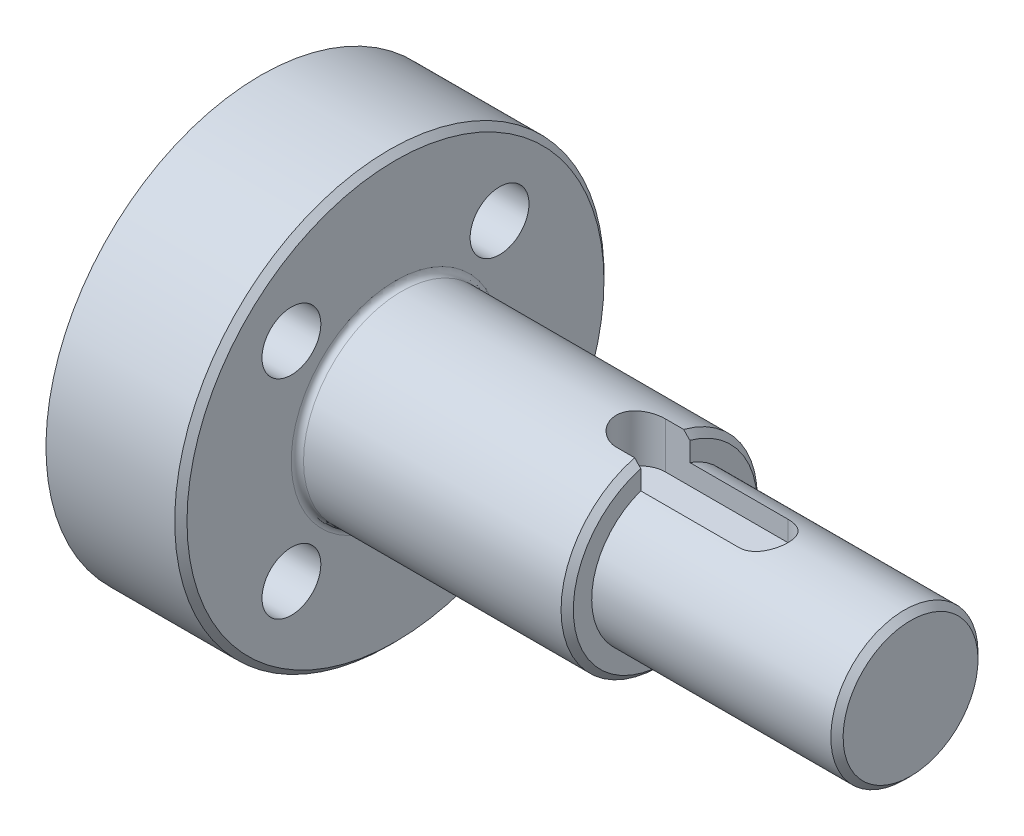
ISO-10303-21;
HEADER;
FILE_DESCRIPTION(('STEP AP214'),'2;1');
FILE_NAME('part.step','',(''),(''),'','','');
FILE_SCHEMA(('AUTOMOTIVE_DESIGN { 1 0 10303 214 1 1 1 1 }'));
ENDSEC;
DATA;
#1=APPLICATION_CONTEXT('core data for automotive mechanical design processes');
#2=APPLICATION_PROTOCOL_DEFINITION('international standard','automotive_design',2000,#1);
#3=PRODUCT_CONTEXT('',#1,'mechanical');
#4=PRODUCT('Part','Part','',(#3));
#5=PRODUCT_RELATED_PRODUCT_CATEGORY('part','',(#4));
#6=PRODUCT_DEFINITION_FORMATION('','',#4);
#7=PRODUCT_DEFINITION_CONTEXT('part definition',#1,'design');
#8=PRODUCT_DEFINITION('design','',#6,#7);
#9=PRODUCT_DEFINITION_SHAPE('','',#8);
#10=(LENGTH_UNIT() NAMED_UNIT(*) SI_UNIT(.MILLI.,.METRE.));
#11=(NAMED_UNIT(*) PLANE_ANGLE_UNIT() SI_UNIT($,.RADIAN.));
#12=(NAMED_UNIT(*) SI_UNIT($,.STERADIAN.) SOLID_ANGLE_UNIT());
#13=UNCERTAINTY_MEASURE_WITH_UNIT(LENGTH_MEASURE(1.E-05),#10,'distance_accuracy_value','');
#14=(GEOMETRIC_REPRESENTATION_CONTEXT(3) GLOBAL_UNCERTAINTY_ASSIGNED_CONTEXT((#13)) GLOBAL_UNIT_ASSIGNED_CONTEXT((#10,
#11,#12)) REPRESENTATION_CONTEXT('',''));
#15=CARTESIAN_POINT('',(0.,0.,0.));
#16=DIRECTION('',(0.,0.,1.));
#17=DIRECTION('',(1.,0.,0.));
#18=AXIS2_PLACEMENT_3D('',#15,#16,#17);
#19=CARTESIAN_POINT('',(24.,0.,0.));
#20=DIRECTION('',(1.,0.,0.));
#21=DIRECTION('',(0.,1.,0.));
#22=AXIS2_PLACEMENT_3D('',#19,#20,#21);
#23=CYLINDRICAL_SURFACE('',#22,3.);
#24=CARTESIAN_POINT('',(23.75,0.,0.));
#25=DIRECTION('',(-1.,0.,0.));
#26=DIRECTION('',(0.,-1.,0.));
#27=AXIS2_PLACEMENT_3D('',#24,#25,#26);
#28=CIRCLE('',#27,3.);
#29=CARTESIAN_POINT('',(23.75,-3.,0.));
#30=VERTEX_POINT('',#29);
#31=EDGE_CURVE('E260',#30,#30,#28,.T.);
#32=ORIENTED_EDGE('',*,*,#31,.T.);
#33=EDGE_LOOP('',(#32));
#34=FACE_BOUND('',#33,.T.);
#35=DIRECTION('',(1.,0.,0.));
#36=VECTOR('',#35,1.);
#37=CARTESIAN_POINT('',(24.,2.82842712474619,1.));
#38=LINE('',#37,#36);
#39=CARTESIAN_POINT('',(14.,2.82842712474619,1.));
#40=VERTEX_POINT('',#39);
#41=CARTESIAN_POINT('',(18.,2.82842712474619,1.));
#42=VERTEX_POINT('',#41);
#43=EDGE_CURVE('E181',#40,#42,#38,.T.);
#44=ORIENTED_EDGE('',*,*,#43,.F.);
#45=CARTESIAN_POINT('',(14.,0.,0.));
#46=DIRECTION('',(1.,0.,0.));
#47=DIRECTION('',(0.,1.,0.));
#48=AXIS2_PLACEMENT_3D('',#45,#46,#47);
#49=CIRCLE('',#48,3.);
#50=CARTESIAN_POINT('',(14.,2.82842712474619,-1.));
#51=VERTEX_POINT('',#50);
#52=EDGE_CURVE('E229',#40,#51,#49,.T.);
#53=ORIENTED_EDGE('',*,*,#52,.T.);
#54=DIRECTION('',(1.,0.,0.));
#55=VECTOR('',#54,1.);
#56=CARTESIAN_POINT('',(24.,2.82842712474619,-1.));
#57=LINE('',#56,#55);
#58=CARTESIAN_POINT('',(18.,2.82842712474619,-1.));
#59=VERTEX_POINT('',#58);
#60=EDGE_CURVE('E173',#59,#51,#57,.F.);
#61=ORIENTED_EDGE('',*,*,#60,.F.);
#62=CARTESIAN_POINT('',(18.,2.82842712474619,1.));
#63=CARTESIAN_POINT('',(18.0272904968011,2.82842442094339,1.0000007474592));
#64=CARTESIAN_POINT('',(18.0545670621893,2.82882259943245,0.998882124587392));
#65=CARTESIAN_POINT('',(18.1089085840549,2.83039327289221,0.994425607036402));
#66=CARTESIAN_POINT('',(18.1359735956597,2.83156555884122,0.991088311433525));
#67=CARTESIAN_POINT('',(18.2163921431951,2.83619092224651,0.977810675230789));
#68=CARTESIAN_POINT('',(18.2691808462705,2.84075292499515,0.964604233028114));
#69=CARTESIAN_POINT('',(18.3716251924438,2.85228074698859,0.929958411830429));
#70=CARTESIAN_POINT('',(18.4212825468729,2.85924523952929,0.908523575987535));
#71=CARTESIAN_POINT('',(18.5163398340055,2.8747878721946,0.85807322896487));
#72=CARTESIAN_POINT('',(18.5617371290674,2.88336700228108,0.829053062822737));
#73=CARTESIAN_POINT('',(18.6487202313245,2.90154480402047,0.763051393523013));
#74=CARTESIAN_POINT('',(18.6901148804626,2.91116877768309,0.725824980322037));
#75=CARTESIAN_POINT('',(18.7662060177917,2.93013848692978,0.644988442991483));
#76=CARTESIAN_POINT('',(18.8009013132559,2.93948417271853,0.601377184554538));
#77=CARTESIAN_POINT('',(18.8634795188042,2.95713882994227,0.507603645956267));
#78=CARTESIAN_POINT('',(18.8911609844023,2.96541437561854,0.4573000893585));
#79=CARTESIAN_POINT('',(18.9375922516873,2.97969608604658,0.352429249965862));
#80=CARTESIAN_POINT('',(18.9563447818204,2.98570294393309,0.297863275593423));
#81=CARTESIAN_POINT('',(18.9837357260914,2.99459071142922,0.188029345478039));
#82=CARTESIAN_POINT('',(18.9927032725537,2.99757308988573,0.132851834460114));
#83=CARTESIAN_POINT('',(19.0013162985256,3.00043608403817,0.0216989694556749));
#84=CARTESIAN_POINT('',(19.0009639992698,3.00031743881302,-0.0342761912453906));
#85=CARTESIAN_POINT('',(18.9911557168934,2.99706038635266,-0.14310384527939));
#86=CARTESIAN_POINT('',(18.9820573620405,2.99404060991264,-0.195992702625535));
#87=CARTESIAN_POINT('',(18.9556068013259,2.98546960500823,-0.299444064376654));
#88=CARTESIAN_POINT('',(18.9382541377938,2.97991823617731,-0.350006439616462));
#89=CARTESIAN_POINT('',(18.8955786303994,2.96675668271304,-0.44815262303096));
#90=CARTESIAN_POINT('',(18.8701539548777,2.95912037838312,-0.49568850565399));
#91=CARTESIAN_POINT('',(18.8121400486093,2.94258387680044,-0.585924589097487));
#92=CARTESIAN_POINT('',(18.7795488689535,2.93368333597593,-0.628623469714683));
#93=CARTESIAN_POINT('',(18.7063289500032,2.91506271942739,-0.71009733971121));
#94=CARTESIAN_POINT('',(18.6653944563903,2.90532378679914,-0.748593611612697));
#95=CARTESIAN_POINT('',(18.5775585102838,2.88647490472851,-0.818272024820382));
#96=CARTESIAN_POINT('',(18.5306551375968,2.87736515915753,-0.849451803183812));
#97=CARTESIAN_POINT('',(18.4313198216467,2.86070031376317,-0.904003325592782));
#98=CARTESIAN_POINT('',(18.3788164850671,2.85317014948234,-0.927253009507682));
#99=CARTESIAN_POINT('',(18.2703530224101,2.84081097062039,-0.964460230701116));
#100=CARTESIAN_POINT('',(18.2143985066279,2.83597769408993,-0.978432436055355));
#101=CARTESIAN_POINT('',(18.131581363252,2.8313654209472,-0.991658156280828));
#102=CARTESIAN_POINT('',(18.1053586101458,2.83026667694602,-0.994785061255116));
#103=CARTESIAN_POINT('',(18.0527619216002,2.82879703571399,-0.998954616071198));
#104=CARTESIAN_POINT('',(18.0263882254556,2.82842519929528,-0.999999955394979));
#105=CARTESIAN_POINT('',(18.,2.82842712474619,-1.));
#106=B_SPLINE_CURVE_WITH_KNOTS('',3,(#62,#63,#64,#65,#66,#67,#68,#69,#70,#71,#72,#73,#74,#75,
#76,#77,#78,#79,#80,#81,#82,#83,#84,#85,#86,#87,#88,#89,#90,#91,#92,#93,#94,#95,#96,#97,#98,#99,
#100,#101,#102,#103,#104,#105),.UNSPECIFIED.,.F.,.F.,(4,2,2,2,2,2,2,2,2,2,2,2,2,2,2,2,2,2,2,2,2,
4),(0.,0.0818184847354301,0.16361488616946,0.326581198395371,0.489457660966237,
0.652434313135311,0.821165049626774,0.98992579863747,1.16309132933101,1.33620391121127,
1.50329470727403,1.67034568030642,1.83084418465735,1.99135158908248,2.15397018825967,
2.31663306588768,2.4869405405805,2.65730294249242,2.8301802992804,3.00278367486839,
3.08199895332751,3.16111181529057),.UNSPECIFIED.);
#107=EDGE_CURVE('E297',#42,#59,#106,.T.);
#108=ORIENTED_EDGE('',*,*,#107,.F.);
#109=EDGE_LOOP('',(#44,#53,#61,#108));
#110=FACE_BOUND('',#109,.T.);
#111=ADVANCED_FACE('F65',(#34,#110),#23,.T.);
#112=CARTESIAN_POINT('',(14.,0.,0.));
#113=DIRECTION('',(-1.,0.,0.));
#114=DIRECTION('',(0.,-1.,0.));
#115=AXIS2_PLACEMENT_3D('',#112,#113,#114);
#116=PLANE('',#115);
#117=DIRECTION('',(0.,-1.,0.));
#118=VECTOR('',#117,1.);
#119=CARTESIAN_POINT('',(14.,0.,1.));
#120=LINE('',#119,#118);
#121=CARTESIAN_POINT('',(14.,3.61420807370024,1.));
#122=VERTEX_POINT('',#121);
#123=EDGE_CURVE('E89',#122,#40,#120,.T.);
#124=ORIENTED_EDGE('',*,*,#123,.F.);
#125=CARTESIAN_POINT('',(14.,0.,0.));
#126=DIRECTION('',(-1.,0.,0.));
#127=DIRECTION('',(0.,-1.,0.));
#128=AXIS2_PLACEMENT_3D('',#125,#126,#127);
#129=CIRCLE('',#128,3.75);
#130=CARTESIAN_POINT('',(14.,3.61420807370024,-1.));
#131=VERTEX_POINT('',#130);
#132=EDGE_CURVE('E248',#122,#131,#129,.F.);
#133=ORIENTED_EDGE('',*,*,#132,.T.);
#134=DIRECTION('',(0.,1.,0.));
#135=VECTOR('',#134,1.);
#136=CARTESIAN_POINT('',(14.,0.,-1.));
#137=LINE('',#136,#135);
#138=EDGE_CURVE('E81',#51,#131,#137,.T.);
#139=ORIENTED_EDGE('',*,*,#138,.F.);
#140=ORIENTED_EDGE('',*,*,#52,.F.);
#141=EDGE_LOOP('',(#124,#133,#139,#140));
#142=FACE_BOUND('',#141,.T.);
#143=ADVANCED_FACE('F313',(#142),#116,.F.);
#144=CARTESIAN_POINT('',(24.,0.,0.));
#145=DIRECTION('',(1.,0.,0.));
#146=DIRECTION('',(0.,1.,0.));
#147=AXIS2_PLACEMENT_3D('',#144,#145,#146);
#148=CYLINDRICAL_SURFACE('',#147,4.);
#149=CARTESIAN_POINT('',(3.25,0.,0.));
#150=DIRECTION('',(-1.,0.,0.));
#151=DIRECTION('',(0.,-1.,0.));
#152=AXIS2_PLACEMENT_3D('',#149,#150,#151);
#153=CIRCLE('',#152,4.);
#154=CARTESIAN_POINT('',(3.25,-4.,0.));
#155=VERTEX_POINT('',#154);
#156=EDGE_CURVE('E74',#155,#155,#153,.F.);
#157=ORIENTED_EDGE('',*,*,#156,.T.);
#158=EDGE_LOOP('',(#157));
#159=FACE_BOUND('',#158,.T.);
#160=DIRECTION('',(1.,0.,0.));
#161=VECTOR('',#160,1.);
#162=CARTESIAN_POINT('',(24.,3.87298334620741,1.));
#163=LINE('',#162,#161);
#164=CARTESIAN_POINT('',(13.,3.87298334620741,1.));
#165=VERTEX_POINT('',#164);
#166=CARTESIAN_POINT('',(13.75,3.87298334620741,1.));
#167=VERTEX_POINT('',#166);
#168=EDGE_CURVE('E176',#165,#167,#163,.T.);
#169=ORIENTED_EDGE('',*,*,#168,.F.);
#170=CARTESIAN_POINT('',(13.,3.87298334620741,-1.));
#171=CARTESIAN_POINT('',(12.9723370148935,3.87298148580177,-1.00000033749611));
#172=CARTESIAN_POINT('',(12.9446877369818,3.8732800994947,-0.998851407375366));
#173=CARTESIAN_POINT('',(12.8895959646964,3.87445904774559,-0.994271295395754));
#174=CARTESIAN_POINT('',(12.8621534363129,3.87533928441687,-0.990840497572679));
#175=CARTESIAN_POINT('',(12.7805468267912,3.87881710972053,-0.977175239382526));
#176=CARTESIAN_POINT('',(12.7269435315178,3.88225203148809,-0.963567695172493));
#177=CARTESIAN_POINT('',(12.622875326218,3.89095422588002,-0.927798076247997));
#178=CARTESIAN_POINT('',(12.5724101217871,3.89622132630929,-0.905636805423836));
#179=CARTESIAN_POINT('',(12.4758885513527,3.90799134471939,-0.853415378025866));
#180=CARTESIAN_POINT('',(12.429833372109,3.91449459395647,-0.823353103356933));
#181=CARTESIAN_POINT('',(12.3424561180939,3.92816262398025,-0.75548447182807));
#182=CARTESIAN_POINT('',(12.3012451137545,3.93533791028916,-0.717537268783977));
#183=CARTESIAN_POINT('',(12.2256979105173,3.94945104396193,-0.635275780516231));
#184=CARTESIAN_POINT('',(12.1913628105321,3.95638885322537,-0.590960479478832));
#185=CARTESIAN_POINT('',(12.1300889983814,3.96936182283248,-0.496456899401691));
#186=CARTESIAN_POINT('',(12.103260104016,3.9753830468173,-0.446195340334474));
#187=CARTESIAN_POINT('',(12.0584752658033,3.98572346250588,-0.34170259084292));
#188=CARTESIAN_POINT('',(12.0405175757002,3.990042989147,-0.28747218408301));
#189=CARTESIAN_POINT('',(12.0143410072226,3.99641900005128,-0.177744108525161));
#190=CARTESIAN_POINT('',(12.0059323275772,3.99851952901301,-0.122294322002858));
#191=CARTESIAN_POINT('',(11.9984966284567,4.00037438150815,-0.0107327756816804));
#192=CARTESIAN_POINT('',(11.9994684298077,4.00012899993444,0.0453789000287047));
#193=CARTESIAN_POINT('',(12.0106299636855,3.99735237365736,0.155352492972095));
#194=CARTESIAN_POINT('',(12.0206146165995,3.9948719867736,0.209236701739854));
#195=CARTESIAN_POINT('',(12.0491886791828,3.98796330636496,0.314538711084339));
#196=CARTESIAN_POINT('',(12.0677784695686,3.98353492665556,0.365956402423987));
#197=CARTESIAN_POINT('',(12.1132012806707,3.97314997761798,0.465407286024538));
#198=CARTESIAN_POINT('',(12.1401073942328,3.96717993827555,0.513405629602247));
#199=CARTESIAN_POINT('',(12.2013431298335,3.95435945541919,0.604276631230013));
#200=CARTESIAN_POINT('',(12.2356738702532,3.94750887933198,0.647148515562288));
#201=CARTESIAN_POINT('',(12.3118789120813,3.93345566022865,0.72776938970849));
#202=CARTESIAN_POINT('',(12.3539316365398,3.92624850477685,0.765349103054126));
#203=CARTESIAN_POINT('',(12.4438298669277,3.91246168284006,0.832969575186236));
#204=CARTESIAN_POINT('',(12.4916769532836,3.90588218842993,0.863008270245061));
#205=CARTESIAN_POINT('',(12.5921455978238,3.89407813586325,0.914804709285961));
#206=CARTESIAN_POINT('',(12.6447914648961,3.88886106009136,0.936517017887269));
#207=CARTESIAN_POINT('',(12.7531169284183,3.88047058807055,0.970702351849828));
#208=CARTESIAN_POINT('',(12.8087918551498,3.87729413761435,0.983189189212131));
#209=CARTESIAN_POINT('',(12.8874573807589,3.87455290681524,0.993904635150937));
#210=CARTESIAN_POINT('',(12.9099197032132,3.87396523110859,0.996190790966708));
#211=CARTESIAN_POINT('',(12.9549177899093,3.87318062488974,0.999236757697393));
#212=CARTESIAN_POINT('',(12.9774533759553,3.87298306219461,0.999999038096045));
#213=CARTESIAN_POINT('',(13.,3.87298334620741,1.));
#214=B_SPLINE_CURVE_WITH_KNOTS('',3,(#170,#171,#172,#173,#174,#175,#176,#177,#178,#179,#180,
#181,#182,#183,#184,#185,#186,#187,#188,#189,#190,#191,#192,#193,#194,#195,#196,#197,#198,#199,
#200,#201,#202,#203,#204,#205,#206,#207,#208,#209,#210,#211,#212,#213),.UNSPECIFIED.,.F.,.F.,(4,
2,2,2,2,2,2,2,2,2,2,2,2,2,2,2,2,2,2,2,2,4),(0.,0.0829365303397727,0.165859106084653,
0.331229963080316,0.496585282091499,0.661984974726748,0.830641897427973,0.999325753539192,
1.17036187098235,1.34136430732424,1.50890481515325,1.67642426256639,1.84022545479275,
2.00403389475838,2.16932509450376,2.33464120964329,2.50441429534542,2.67423379180967,
2.84496720161068,3.01544447539986,3.08315848722648,3.15076267731671),.UNSPECIFIED.);
#215=CARTESIAN_POINT('',(13.,3.87298334620741,-1.));
#216=VERTEX_POINT('',#215);
#217=EDGE_CURVE('E132',#216,#165,#214,.T.);
#218=ORIENTED_EDGE('',*,*,#217,.F.);
#219=DIRECTION('',(1.,0.,0.));
#220=VECTOR('',#219,1.);
#221=CARTESIAN_POINT('',(24.,3.87298334620741,-1.));
#222=LINE('',#221,#220);
#223=CARTESIAN_POINT('',(13.75,3.87298334620741,-1.));
#224=VERTEX_POINT('',#223);
#225=EDGE_CURVE('E135',#224,#216,#222,.F.);
#226=ORIENTED_EDGE('',*,*,#225,.F.);
#227=CARTESIAN_POINT('',(13.75,0.,0.));
#228=DIRECTION('',(-1.,0.,0.));
#229=DIRECTION('',(0.,-1.,0.));
#230=AXIS2_PLACEMENT_3D('',#227,#228,#229);
#231=CIRCLE('',#230,4.);
#232=EDGE_CURVE('E252',#224,#167,#231,.T.);
#233=ORIENTED_EDGE('',*,*,#232,.T.);
#234=EDGE_LOOP('',(#169,#218,#226,#233));
#235=FACE_BOUND('',#234,.T.);
#236=ADVANCED_FACE('F390',(#159,#235),#148,.T.);
#237=CARTESIAN_POINT('',(14.,0.,0.));
#238=DIRECTION('',(-1.,0.,0.));
#239=DIRECTION('',(0.,-1.,0.));
#240=AXIS2_PLACEMENT_3D('',#237,#238,#239);
#241=CONICAL_SURFACE('',#240,3.75,0.785398163397448);
#242=ORIENTED_EDGE('',*,*,#132,.F.);
#243=CARTESIAN_POINT('',(16.0157644370746,1.41688848810168,1.));
#244=CARTESIAN_POINT('',(15.9620809124287,1.48254695804357,1.));
#245=CARTESIAN_POINT('',(15.9077076974055,1.5476319600914,1.));
#246=CARTESIAN_POINT('',(15.7978901131886,1.67688164271462,1.));
#247=CARTESIAN_POINT('',(15.7424458562416,1.74104641851612,1.));
#248=CARTESIAN_POINT('',(15.630797709636,1.86867914905829,1.));
#249=CARTESIAN_POINT('',(15.5745940225952,1.9321472817835,1.));
#250=CARTESIAN_POINT('',(15.4615877619381,2.05855103573608,1.));
#251=CARTESIAN_POINT('',(15.4047851703288,2.12148664086183,1.));
#252=CARTESIAN_POINT('',(15.2337287968054,2.3096244705968,1.));
#253=CARTESIAN_POINT('',(15.1187878570313,2.43420138547952,1.));
#254=CARTESIAN_POINT('',(14.8877307759525,2.68227567826739,1.));
#255=CARTESIAN_POINT('',(14.7716145370067,2.80577296486452,1.));
#256=CARTESIAN_POINT('',(14.535145262508,3.05564542967055,1.));
#257=CARTESIAN_POINT('',(14.4147683278564,3.18199797105842,1.));
#258=CARTESIAN_POINT('',(14.1734176866013,3.43413175641541,1.));
#259=CARTESIAN_POINT('',(14.0524439782558,3.55991299871494,1.));
#260=CARTESIAN_POINT('',(13.6888841628384,3.93662719801796,1.));
#261=CARTESIAN_POINT('',(13.4456530030218,4.18693731103132,1.));
#262=CARTESIAN_POINT('',(12.9580802516466,4.68673547289824,1.));
#263=CARTESIAN_POINT('',(12.713738131154,4.93622300455382,1.));
#264=CARTESIAN_POINT('',(12.2243982797071,5.43455143633785,1.));
#265=CARTESIAN_POINT('',(11.9794005529469,5.68339234058296,1.));
#266=CARTESIAN_POINT('',(11.7342355629254,5.93206724189569,1.));
#267=B_SPLINE_CURVE_WITH_KNOTS('',3,(#243,#244,#245,#246,#247,#248,#249,#250,#251,#252,#253,
#254,#255,#256,#257,#258,#259,#260,#261,#262,#263,#264,#265,#266),.UNSPECIFIED.,.F.,.F.,(4,2,2,
2,2,2,2,2,2,2,2,4),(0.,0.254418535812733,0.508810551312933,0.763135984405125,1.01746908005956,
1.5259605074314,2.0344945315925,2.55803735603119,3.08158170951894,4.12864273413816,
5.17626945243916,6.22388948476793),.UNSPECIFIED.);
#268=EDGE_CURVE('E273',#122,#167,#267,.T.);
#269=ORIENTED_EDGE('',*,*,#268,.T.);
#270=ORIENTED_EDGE('',*,*,#232,.F.);
#271=CARTESIAN_POINT('',(11.7342355629254,5.93206724189568,-1.));
#272=CARTESIAN_POINT('',(11.9162929379125,5.74742737321911,-1.));
#273=CARTESIAN_POINT('',(12.0982444664237,5.56268279745674,-1.));
#274=CARTESIAN_POINT('',(12.4618186251271,5.19288411268343,-1.));
#275=CARTESIAN_POINT('',(12.64344126751,5.00783001565555,-1.));
#276=CARTESIAN_POINT('',(13.0062097446631,4.63734365743845,-1.));
#277=CARTESIAN_POINT('',(13.1873556854789,4.45191150016412,-1.));
#278=CARTESIAN_POINT('',(13.5490319311143,4.08043296138168,-1.));
#279=CARTESIAN_POINT('',(13.7295622108332,3.89438655542484,-1.));
#280=CARTESIAN_POINT('',(14.0897640511782,3.52132305951913,-1.));
#281=CARTESIAN_POINT('',(14.2694352524438,3.33430562178076,-1.));
#282=CARTESIAN_POINT('',(14.5377995421626,3.05270801328353,-1.));
#283=CARTESIAN_POINT('',(14.6270594490508,2.95866830066621,-1.));
#284=CARTESIAN_POINT('',(14.8050795880422,2.77011312870758,-1.));
#285=CARTESIAN_POINT('',(14.8938398101726,2.67559765994182,-1.));
#286=CARTESIAN_POINT('',(15.070720644728,2.48590318372165,-1.));
#287=CARTESIAN_POINT('',(15.1588410064363,2.39072394209098,-1.));
#288=CARTESIAN_POINT('',(15.3341392810104,2.19950986548784,-1.));
#289=CARTESIAN_POINT('',(15.4213172454583,2.10347507787388,-1.));
#290=CARTESIAN_POINT('',(15.5943500764221,1.91015664129409,-1.));
#291=CARTESIAN_POINT('',(15.6802044916629,1.81287258623483,-1.));
#292=CARTESIAN_POINT('',(15.8074323949499,1.66558625041674,-1.));
#293=CARTESIAN_POINT('',(15.8495865788171,1.61625946014545,-1.));
#294=CARTESIAN_POINT('',(15.9332208443044,1.51703284247258,-1.));
#295=CARTESIAN_POINT('',(15.9747008824898,1.46713297849894,-1.));
#296=CARTESIAN_POINT('',(16.0157644370746,1.41688848810168,-1.));
#297=B_SPLINE_CURVE_WITH_KNOTS('',3,(#271,#272,#273,#274,#275,#276,#277,#278,#279,#280,#281,
#282,#283,#284,#285,#286,#287,#288,#289,#290,#291,#292,#293,#294,#295,#296),.UNSPECIFIED.,.F.,
.F.,(4,2,2,2,2,2,2,2,2,2,2,2,4),(0.,0.777901926687156,1.55577440363923,2.33345604171232,
3.11116901601679,3.88918296409064,4.27815101505478,4.66712680180913,5.05624756252509,
5.44534691577915,5.83457612542308,6.02922682543276,6.22389001734463),.UNSPECIFIED.);
#298=EDGE_CURVE('E264',#224,#131,#297,.T.);
#299=ORIENTED_EDGE('',*,*,#298,.T.);
#300=EDGE_LOOP('',(#242,#269,#270,#299));
#301=FACE_BOUND('',#300,.T.);
#302=ADVANCED_FACE('F281',(#301),#241,.T.);
#303=CARTESIAN_POINT('',(-0.25,0.,0.));
#304=DIRECTION('',(1.,0.,0.));
#305=DIRECTION('',(0.,1.,0.));
#306=AXIS2_PLACEMENT_3D('',#303,#304,#305);
#307=TOROIDAL_SURFACE('',#306,8.,0.25);
#308=CARTESIAN_POINT('',(-0.375,0.,0.));
#309=DIRECTION('',(1.,0.,0.));
#310=DIRECTION('',(0.,1.,0.));
#311=AXIS2_PLACEMENT_3D('',#308,#309,#310);
#312=CIRCLE('',#311,8.21650635094611);
#313=CARTESIAN_POINT('',(-0.375,8.21650635094611,0.));
#314=VERTEX_POINT('',#313);
#315=EDGE_CURVE('E213',#314,#314,#312,.T.);
#316=ORIENTED_EDGE('',*,*,#315,.F.);
#317=EDGE_LOOP('',(#316));
#318=FACE_BOUND('',#317,.T.);
#319=CARTESIAN_POINT('',(0.,0.,0.));
#320=DIRECTION('',(1.,0.,0.));
#321=DIRECTION('',(0.,1.,0.));
#322=AXIS2_PLACEMENT_3D('',#319,#320,#321);
#323=CIRCLE('',#322,8.);
#324=CARTESIAN_POINT('',(0.,8.,0.));
#325=VERTEX_POINT('',#324);
#326=EDGE_CURVE('E233',#325,#325,#323,.T.);
#327=ORIENTED_EDGE('',*,*,#326,.T.);
#328=EDGE_LOOP('',(#327));
#329=FACE_BOUND('',#328,.T.);
#330=ADVANCED_FACE('F323',(#318,#329),#307,.F.);
#331=CARTESIAN_POINT('',(0.,0.,0.));
#332=DIRECTION('',(1.,0.,0.));
#333=DIRECTION('',(0.,1.,0.));
#334=AXIS2_PLACEMENT_3D('',#331,#332,#333);
#335=PLANE('',#334);
#336=CARTESIAN_POINT('',(0.,4.24264068711926,4.24264068711931));
#337=DIRECTION('',(1.,0.,0.));
#338=DIRECTION('',(0.,1.,0.));
#339=AXIS2_PLACEMENT_3D('',#336,#337,#338);
#340=CIRCLE('',#339,1.2);
#341=CARTESIAN_POINT('',(0.,5.44264068711926,4.24264068711931));
#342=VERTEX_POINT('',#341);
#343=EDGE_CURVE('E188',#342,#342,#340,.T.);
#344=ORIENTED_EDGE('',*,*,#343,.T.);
#345=EDGE_LOOP('',(#344));
#346=FACE_BOUND('',#345,.T.);
#347=CARTESIAN_POINT('',(0.,-4.24264068711931,4.24264068711926));
#348=DIRECTION('',(1.,0.,0.));
#349=DIRECTION('',(0.,1.,0.));
#350=AXIS2_PLACEMENT_3D('',#347,#348,#349);
#351=CIRCLE('',#350,1.2);
#352=CARTESIAN_POINT('',(0.,-3.04264068711931,4.24264068711926));
#353=VERTEX_POINT('',#352);
#354=EDGE_CURVE('E196',#353,#353,#351,.T.);
#355=ORIENTED_EDGE('',*,*,#354,.T.);
#356=EDGE_LOOP('',(#355));
#357=FACE_BOUND('',#356,.T.);
#358=CARTESIAN_POINT('',(0.,-4.24264068711926,-4.24264068711931));
#359=DIRECTION('',(1.,0.,0.));
#360=DIRECTION('',(0.,1.,0.));
#361=AXIS2_PLACEMENT_3D('',#358,#359,#360);
#362=CIRCLE('',#361,1.2);
#363=CARTESIAN_POINT('',(0.,-3.04264068711926,-4.24264068711931));
#364=VERTEX_POINT('',#363);
#365=EDGE_CURVE('E204',#364,#364,#362,.T.);
#366=ORIENTED_EDGE('',*,*,#365,.T.);
#367=EDGE_LOOP('',(#366));
#368=FACE_BOUND('',#367,.T.);
#369=CARTESIAN_POINT('',(0.,4.24264068711931,-4.24264068711926));
#370=DIRECTION('',(1.,0.,0.));
#371=DIRECTION('',(0.,1.,0.));
#372=AXIS2_PLACEMENT_3D('',#369,#370,#371);
#373=CIRCLE('',#372,1.2);
#374=CARTESIAN_POINT('',(0.,5.44264068711931,-4.24264068711926));
#375=VERTEX_POINT('',#374);
#376=EDGE_CURVE('E209',#375,#375,#373,.T.);
#377=ORIENTED_EDGE('',*,*,#376,.T.);
#378=EDGE_LOOP('',(#377));
#379=FACE_BOUND('',#378,.T.);
#380=ORIENTED_EDGE('',*,*,#326,.F.);
#381=EDGE_LOOP('',(#380));
#382=FACE_BOUND('',#381,.T.);
#383=ADVANCED_FACE('F319',(#346,#357,#368,#379,#382),#335,.F.);
#384=CARTESIAN_POINT('',(24.,0.,0.));
#385=DIRECTION('',(-1.,0.,0.));
#386=DIRECTION('',(0.,-1.,0.));
#387=AXIS2_PLACEMENT_3D('',#384,#385,#386);
#388=PLANE('',#387);
#389=CARTESIAN_POINT('',(24.,0.,0.));
#390=DIRECTION('',(-1.,0.,0.));
#391=DIRECTION('',(0.,-1.,0.));
#392=AXIS2_PLACEMENT_3D('',#389,#390,#391);
#393=CIRCLE('',#392,2.75);
#394=CARTESIAN_POINT('',(24.,-2.75,0.));
#395=VERTEX_POINT('',#394);
#396=EDGE_CURVE('E256',#395,#395,#393,.F.);
#397=ORIENTED_EDGE('',*,*,#396,.T.);
#398=EDGE_LOOP('',(#397));
#399=FACE_BOUND('',#398,.T.);
#400=ADVANCED_FACE('F315',(#399),#388,.F.);
#401=CARTESIAN_POINT('',(3.,0.,0.));
#402=DIRECTION('',(-1.,0.,0.));
#403=DIRECTION('',(0.,-1.,0.));
#404=AXIS2_PLACEMENT_3D('',#401,#402,#403);
#405=PLANE('',#404);
#406=CARTESIAN_POINT('',(3.,0.,0.));
#407=DIRECTION('',(-1.,0.,0.));
#408=DIRECTION('',(0.,-1.,0.));
#409=AXIS2_PLACEMENT_3D('',#406,#407,#408);
#410=CIRCLE('',#409,4.25);
#411=CARTESIAN_POINT('',(3.,-4.25,0.));
#412=VERTEX_POINT('',#411);
#413=EDGE_CURVE('E13',#412,#412,#410,.T.);
#414=ORIENTED_EDGE('',*,*,#413,.T.);
#415=EDGE_LOOP('',(#414));
#416=FACE_BOUND('',#415,.T.);
#417=CARTESIAN_POINT('',(3.,0.,0.));
#418=DIRECTION('',(-1.,0.,0.));
#419=DIRECTION('',(0.,-1.,0.));
#420=AXIS2_PLACEMENT_3D('',#417,#418,#419);
#421=CIRCLE('',#420,8.5);
#422=CARTESIAN_POINT('',(3.,-8.5,0.));
#423=VERTEX_POINT('',#422);
#424=EDGE_CURVE('E237',#423,#423,#421,.F.);
#425=ORIENTED_EDGE('',*,*,#424,.T.);
#426=EDGE_LOOP('',(#425));
#427=FACE_BOUND('',#426,.T.);
#428=CARTESIAN_POINT('',(3.,4.24264068711926,4.24264068711931));
#429=DIRECTION('',(1.,0.,0.));
#430=DIRECTION('',(0.,0.,-1.));
#431=AXIS2_PLACEMENT_3D('',#428,#429,#430);
#432=CIRCLE('',#431,1.2);
#433=CARTESIAN_POINT('',(3.,4.24264068711926,3.04264068711931));
#434=VERTEX_POINT('',#433);
#435=EDGE_CURVE('E184',#434,#434,#432,.T.);
#436=ORIENTED_EDGE('',*,*,#435,.F.);
#437=EDGE_LOOP('',(#436));
#438=FACE_BOUND('',#437,.T.);
#439=CARTESIAN_POINT('',(3.,-4.24264068711931,4.24264068711926));
#440=DIRECTION('',(1.,0.,0.));
#441=DIRECTION('',(0.,0.,-1.));
#442=AXIS2_PLACEMENT_3D('',#439,#440,#441);
#443=CIRCLE('',#442,1.2);
#444=CARTESIAN_POINT('',(3.,-4.24264068711931,3.04264068711926));
#445=VERTEX_POINT('',#444);
#446=EDGE_CURVE('E192',#445,#445,#443,.T.);
#447=ORIENTED_EDGE('',*,*,#446,.F.);
#448=EDGE_LOOP('',(#447));
#449=FACE_BOUND('',#448,.T.);
#450=CARTESIAN_POINT('',(3.,-4.24264068711926,-4.24264068711931));
#451=DIRECTION('',(1.,0.,0.));
#452=DIRECTION('',(0.,0.,-1.));
#453=AXIS2_PLACEMENT_3D('',#450,#451,#452);
#454=CIRCLE('',#453,1.2);
#455=CARTESIAN_POINT('',(3.,-4.24264068711926,-5.44264068711931));
#456=VERTEX_POINT('',#455);
#457=EDGE_CURVE('E200',#456,#456,#454,.T.);
#458=ORIENTED_EDGE('',*,*,#457,.F.);
#459=EDGE_LOOP('',(#458));
#460=FACE_BOUND('',#459,.T.);
#461=CARTESIAN_POINT('',(3.,4.24264068711931,-4.24264068711926));
#462=DIRECTION('',(1.,0.,0.));
#463=DIRECTION('',(0.,0.,-1.));
#464=AXIS2_PLACEMENT_3D('',#461,#462,#463);
#465=CIRCLE('',#464,1.2);
#466=CARTESIAN_POINT('',(3.,4.24264068711931,-5.44264068711926));
#467=VERTEX_POINT('',#466);
#468=EDGE_CURVE('E205',#467,#467,#465,.T.);
#469=ORIENTED_EDGE('',*,*,#468,.F.);
#470=EDGE_LOOP('',(#469));
#471=FACE_BOUND('',#470,.T.);
#472=ADVANCED_FACE('F318',(#416,#427,#438,#449,#460,#471),#405,.F.);
#473=CARTESIAN_POINT('',(24.,0.,0.));
#474=DIRECTION('',(1.,0.,0.));
#475=DIRECTION('',(0.,1.,0.));
#476=AXIS2_PLACEMENT_3D('',#473,#474,#475);
#477=CYLINDRICAL_SURFACE('',#476,8.75);
#478=CARTESIAN_POINT('',(2.75,0.,0.));
#479=DIRECTION('',(-1.,0.,0.));
#480=DIRECTION('',(0.,-1.,0.));
#481=AXIS2_PLACEMENT_3D('',#478,#479,#480);
#482=CIRCLE('',#481,8.75);
#483=CARTESIAN_POINT('',(2.75,-8.75,0.));
#484=VERTEX_POINT('',#483);
#485=EDGE_CURVE('E244',#484,#484,#482,.T.);
#486=ORIENTED_EDGE('',*,*,#485,.T.);
#487=EDGE_LOOP('',(#486));
#488=FACE_BOUND('',#487,.T.);
#489=CARTESIAN_POINT('',(-2.5,0.,0.));
#490=DIRECTION('',(1.,0.,0.));
#491=DIRECTION('',(0.,1.,0.));
#492=AXIS2_PLACEMENT_3D('',#489,#490,#491);
#493=CIRCLE('',#492,8.75);
#494=CARTESIAN_POINT('',(-2.5,8.75,0.));
#495=VERTEX_POINT('',#494);
#496=EDGE_CURVE('E225',#495,#495,#493,.T.);
#497=ORIENTED_EDGE('',*,*,#496,.T.);
#498=EDGE_LOOP('',(#497));
#499=FACE_BOUND('',#498,.T.);
#500=ADVANCED_FACE('F349',(#488,#499),#477,.T.);
#501=CARTESIAN_POINT('',(-2.5,0.,0.));
#502=DIRECTION('',(1.,0.,0.));
#503=DIRECTION('',(0.,1.,0.));
#504=AXIS2_PLACEMENT_3D('',#501,#502,#503);
#505=PLANE('',#504);
#506=ORIENTED_EDGE('',*,*,#496,.F.);
#507=EDGE_LOOP('',(#506));
#508=FACE_BOUND('',#507,.T.);
#509=CARTESIAN_POINT('',(-2.5,0.,0.));
#510=DIRECTION('',(1.,0.,0.));
#511=DIRECTION('',(0.,1.,0.));
#512=AXIS2_PLACEMENT_3D('',#509,#510,#511);
#513=CIRCLE('',#512,8.);
#514=CARTESIAN_POINT('',(-2.5,8.,0.));
#515=VERTEX_POINT('',#514);
#516=EDGE_CURVE('E221',#515,#515,#513,.T.);
#517=ORIENTED_EDGE('',*,*,#516,.T.);
#518=EDGE_LOOP('',(#517));
#519=FACE_BOUND('',#518,.T.);
#520=ADVANCED_FACE('F384',(#508,#519),#505,.F.);
#521=CARTESIAN_POINT('',(24.,0.,0.));
#522=DIRECTION('',(1.,0.,0.));
#523=DIRECTION('',(0.,1.,0.));
#524=AXIS2_PLACEMENT_3D('',#521,#522,#523);
#525=CYLINDRICAL_SURFACE('',#524,8.);
#526=ORIENTED_EDGE('',*,*,#516,.F.);
#527=EDGE_LOOP('',(#526));
#528=FACE_BOUND('',#527,.T.);
#529=CARTESIAN_POINT('',(-0.749999999999997,0.,0.));
#530=DIRECTION('',(1.,0.,0.));
#531=DIRECTION('',(0.,1.,0.));
#532=AXIS2_PLACEMENT_3D('',#529,#530,#531);
#533=CIRCLE('',#532,8.);
#534=CARTESIAN_POINT('',(-0.749999999999997,8.,0.));
#535=VERTEX_POINT('',#534);
#536=EDGE_CURVE('E217',#535,#535,#533,.T.);
#537=ORIENTED_EDGE('',*,*,#536,.T.);
#538=EDGE_LOOP('',(#537));
#539=FACE_BOUND('',#538,.T.);
#540=ADVANCED_FACE('F377',(#528,#539),#525,.F.);
#541=CARTESIAN_POINT('',(-0.375,0.,0.));
#542=DIRECTION('',(1.,0.,0.));
#543=DIRECTION('',(0.,1.,0.));
#544=AXIS2_PLACEMENT_3D('',#541,#542,#543);
#545=CONICAL_SURFACE('',#544,8.21650635094611,0.523598775598301);
#546=ORIENTED_EDGE('',*,*,#536,.F.);
#547=EDGE_LOOP('',(#546));
#548=FACE_BOUND('',#547,.T.);
#549=ORIENTED_EDGE('',*,*,#315,.T.);
#550=EDGE_LOOP('',(#549));
#551=FACE_BOUND('',#550,.T.);
#552=ADVANCED_FACE('F364',(#548,#551),#545,.F.);
#553=CARTESIAN_POINT('',(3.,4.24264068711931,-4.24264068711926));
#554=DIRECTION('',(1.,0.,0.));
#555=DIRECTION('',(0.,0.,-1.));
#556=AXIS2_PLACEMENT_3D('',#553,#554,#555);
#557=CYLINDRICAL_SURFACE('',#556,1.2);
#558=ORIENTED_EDGE('',*,*,#468,.T.);
#559=EDGE_LOOP('',(#558));
#560=FACE_BOUND('',#559,.T.);
#561=ORIENTED_EDGE('',*,*,#376,.F.);
#562=EDGE_LOOP('',(#561));
#563=FACE_BOUND('',#562,.T.);
#564=ADVANCED_FACE('F360',(#560,#563),#557,.F.);
#565=CARTESIAN_POINT('',(3.,-4.24264068711926,-4.24264068711931));
#566=DIRECTION('',(1.,0.,0.));
#567=DIRECTION('',(0.,0.,-1.));
#568=AXIS2_PLACEMENT_3D('',#565,#566,#567);
#569=CYLINDRICAL_SURFACE('',#568,1.2);
#570=ORIENTED_EDGE('',*,*,#457,.T.);
#571=EDGE_LOOP('',(#570));
#572=FACE_BOUND('',#571,.T.);
#573=ORIENTED_EDGE('',*,*,#365,.F.);
#574=EDGE_LOOP('',(#573));
#575=FACE_BOUND('',#574,.T.);
#576=ADVANCED_FACE('F363',(#572,#575),#569,.F.);
#577=CARTESIAN_POINT('',(3.,-4.24264068711931,4.24264068711926));
#578=DIRECTION('',(1.,0.,0.));
#579=DIRECTION('',(0.,0.,-1.));
#580=AXIS2_PLACEMENT_3D('',#577,#578,#579);
#581=CYLINDRICAL_SURFACE('',#580,1.2);
#582=ORIENTED_EDGE('',*,*,#446,.T.);
#583=EDGE_LOOP('',(#582));
#584=FACE_BOUND('',#583,.T.);
#585=ORIENTED_EDGE('',*,*,#354,.F.);
#586=EDGE_LOOP('',(#585));
#587=FACE_BOUND('',#586,.T.);
#588=ADVANCED_FACE('F340',(#584,#587),#581,.F.);
#589=CARTESIAN_POINT('',(3.,4.24264068711926,4.24264068711931));
#590=DIRECTION('',(1.,0.,0.));
#591=DIRECTION('',(0.,0.,-1.));
#592=AXIS2_PLACEMENT_3D('',#589,#590,#591);
#593=CYLINDRICAL_SURFACE('',#592,1.2);
#594=ORIENTED_EDGE('',*,*,#435,.T.);
#595=EDGE_LOOP('',(#594));
#596=FACE_BOUND('',#595,.T.);
#597=ORIENTED_EDGE('',*,*,#343,.F.);
#598=EDGE_LOOP('',(#597));
#599=FACE_BOUND('',#598,.T.);
#600=ADVANCED_FACE('F332',(#596,#599),#593,.F.);
#601=CARTESIAN_POINT('',(3.,0.,0.));
#602=DIRECTION('',(-1.,0.,0.));
#603=DIRECTION('',(0.,-1.,0.));
#604=AXIS2_PLACEMENT_3D('',#601,#602,#603);
#605=CONICAL_SURFACE('',#604,8.5,0.785398163397448);
#606=ORIENTED_EDGE('',*,*,#485,.F.);
#607=EDGE_LOOP('',(#606));
#608=FACE_BOUND('',#607,.T.);
#609=ORIENTED_EDGE('',*,*,#424,.F.);
#610=EDGE_LOOP('',(#609));
#611=FACE_BOUND('',#610,.T.);
#612=ADVANCED_FACE('F328',(#608,#611),#605,.T.);
#613=CARTESIAN_POINT('',(24.,0.,0.));
#614=DIRECTION('',(-1.,0.,0.));
#615=DIRECTION('',(0.,-1.,0.));
#616=AXIS2_PLACEMENT_3D('',#613,#614,#615);
#617=CONICAL_SURFACE('',#616,2.75,0.785398163397447);
#618=ORIENTED_EDGE('',*,*,#31,.F.);
#619=EDGE_LOOP('',(#618));
#620=FACE_BOUND('',#619,.T.);
#621=ORIENTED_EDGE('',*,*,#396,.F.);
#622=EDGE_LOOP('',(#621));
#623=FACE_BOUND('',#622,.T.);
#624=ADVANCED_FACE('F292',(#620,#623),#617,.T.);
#625=CARTESIAN_POINT('',(18.,8.75,0.));
#626=DIRECTION('',(0.,-1.,0.));
#627=DIRECTION('',(0.,0.,-1.));
#628=AXIS2_PLACEMENT_3D('',#625,#626,#627);
#629=CYLINDRICAL_SURFACE('',#628,1.);
#630=ORIENTED_EDGE('',*,*,#107,.T.);
#631=DIRECTION('',(0.,-1.,0.));
#632=VECTOR('',#631,1.);
#633=CARTESIAN_POINT('',(18.,8.75,-1.));
#634=LINE('',#633,#632);
#635=CARTESIAN_POINT('',(18.,2.,-1.));
#636=VERTEX_POINT('',#635);
#637=EDGE_CURVE('E164',#59,#636,#634,.T.);
#638=ORIENTED_EDGE('',*,*,#637,.T.);
#639=CARTESIAN_POINT('',(18.,2.,0.));
#640=DIRECTION('',(0.,1.,0.));
#641=DIRECTION('',(0.,0.,1.));
#642=AXIS2_PLACEMENT_3D('',#639,#640,#641);
#643=CIRCLE('',#642,1.);
#644=CARTESIAN_POINT('',(18.,2.,1.));
#645=VERTEX_POINT('',#644);
#646=EDGE_CURVE('E146',#645,#636,#643,.T.);
#647=ORIENTED_EDGE('',*,*,#646,.F.);
#648=DIRECTION('',(0.,-1.,0.));
#649=VECTOR('',#648,1.);
#650=CARTESIAN_POINT('',(18.,8.75,1.));
#651=LINE('',#650,#649);
#652=EDGE_CURVE('E136',#42,#645,#651,.T.);
#653=ORIENTED_EDGE('',*,*,#652,.F.);
#654=EDGE_LOOP('',(#630,#638,#647,#653));
#655=FACE_BOUND('',#654,.T.);
#656=ADVANCED_FACE('F289',(#655),#629,.F.);
#657=CARTESIAN_POINT('',(13.,8.75,0.));
#658=DIRECTION('',(0.,-1.,0.));
#659=DIRECTION('',(0.,0.,-1.));
#660=AXIS2_PLACEMENT_3D('',#657,#658,#659);
#661=CYLINDRICAL_SURFACE('',#660,1.);
#662=ORIENTED_EDGE('',*,*,#217,.T.);
#663=DIRECTION('',(0.,-1.,0.));
#664=VECTOR('',#663,1.);
#665=CARTESIAN_POINT('',(13.,8.75,1.));
#666=LINE('',#665,#664);
#667=CARTESIAN_POINT('',(13.,2.,1.));
#668=VERTEX_POINT('',#667);
#669=EDGE_CURVE('E125',#165,#668,#666,.T.);
#670=ORIENTED_EDGE('',*,*,#669,.T.);
#671=CARTESIAN_POINT('',(13.,2.,0.));
#672=DIRECTION('',(0.,1.,0.));
#673=DIRECTION('',(0.,0.,1.));
#674=AXIS2_PLACEMENT_3D('',#671,#672,#673);
#675=CIRCLE('',#674,1.);
#676=CARTESIAN_POINT('',(13.,2.,-1.));
#677=VERTEX_POINT('',#676);
#678=EDGE_CURVE('E130',#677,#668,#675,.T.);
#679=ORIENTED_EDGE('',*,*,#678,.F.);
#680=DIRECTION('',(0.,-1.,0.));
#681=VECTOR('',#680,1.);
#682=CARTESIAN_POINT('',(13.,8.75,-1.));
#683=LINE('',#682,#681);
#684=EDGE_CURVE('E161',#216,#677,#683,.T.);
#685=ORIENTED_EDGE('',*,*,#684,.F.);
#686=EDGE_LOOP('',(#662,#670,#679,#685));
#687=FACE_BOUND('',#686,.T.);
#688=ADVANCED_FACE('F127',(#687),#661,.F.);
#689=CARTESIAN_POINT('',(13.,8.75,1.));
#690=DIRECTION('',(0.,0.,-1.));
#691=DIRECTION('',(-1.,0.,0.));
#692=AXIS2_PLACEMENT_3D('',#689,#690,#691);
#693=PLANE('',#692);
#694=ORIENTED_EDGE('',*,*,#43,.T.);
#695=ORIENTED_EDGE('',*,*,#652,.T.);
#696=DIRECTION('',(1.,0.,0.));
#697=VECTOR('',#696,1.);
#698=CARTESIAN_POINT('',(13.,2.,1.));
#699=LINE('',#698,#697);
#700=EDGE_CURVE('E139',#668,#645,#699,.T.);
#701=ORIENTED_EDGE('',*,*,#700,.F.);
#702=ORIENTED_EDGE('',*,*,#669,.F.);
#703=ORIENTED_EDGE('',*,*,#168,.T.);
#704=ORIENTED_EDGE('',*,*,#268,.F.);
#705=ORIENTED_EDGE('',*,*,#123,.T.);
#706=EDGE_LOOP('',(#694,#695,#701,#702,#703,#704,#705));
#707=FACE_BOUND('',#706,.T.);
#708=ADVANCED_FACE('F140',(#707),#693,.T.);
#709=CARTESIAN_POINT('',(13.,8.75,-1.));
#710=DIRECTION('',(0.,0.,1.));
#711=DIRECTION('',(1.,0.,0.));
#712=AXIS2_PLACEMENT_3D('',#709,#710,#711);
#713=PLANE('',#712);
#714=ORIENTED_EDGE('',*,*,#60,.T.);
#715=ORIENTED_EDGE('',*,*,#138,.T.);
#716=ORIENTED_EDGE('',*,*,#298,.F.);
#717=ORIENTED_EDGE('',*,*,#225,.T.);
#718=ORIENTED_EDGE('',*,*,#684,.T.);
#719=DIRECTION('',(-1.,0.,0.));
#720=VECTOR('',#719,1.);
#721=CARTESIAN_POINT('',(13.,2.,-1.));
#722=LINE('',#721,#720);
#723=EDGE_CURVE('E151',#636,#677,#722,.T.);
#724=ORIENTED_EDGE('',*,*,#723,.F.);
#725=ORIENTED_EDGE('',*,*,#637,.F.);
#726=EDGE_LOOP('',(#714,#715,#716,#717,#718,#724,#725));
#727=FACE_BOUND('',#726,.T.);
#728=ADVANCED_FACE('F284',(#727),#713,.T.);
#729=CARTESIAN_POINT('',(13.,2.,0.));
#730=DIRECTION('',(0.,1.,0.));
#731=DIRECTION('',(0.,0.,1.));
#732=AXIS2_PLACEMENT_3D('',#729,#730,#731);
#733=PLANE('',#732);
#734=ORIENTED_EDGE('',*,*,#678,.T.);
#735=ORIENTED_EDGE('',*,*,#700,.T.);
#736=ORIENTED_EDGE('',*,*,#646,.T.);
#737=ORIENTED_EDGE('',*,*,#723,.T.);
#738=EDGE_LOOP('',(#734,#735,#736,#737));
#739=FACE_BOUND('',#738,.T.);
#740=ADVANCED_FACE('F149',(#739),#733,.T.);
#741=CARTESIAN_POINT('',(3.25,0.,0.));
#742=DIRECTION('',(-1.,0.,0.));
#743=DIRECTION('',(0.,-1.,0.));
#744=AXIS2_PLACEMENT_3D('',#741,#742,#743);
#745=TOROIDAL_SURFACE('',#744,4.25,0.25);
#746=ORIENTED_EDGE('',*,*,#413,.F.);
#747=EDGE_LOOP('',(#746));
#748=FACE_BOUND('',#747,.T.);
#749=ORIENTED_EDGE('',*,*,#156,.F.);
#750=EDGE_LOOP('',(#749));
#751=FACE_BOUND('',#750,.T.);
#752=ADVANCED_FACE('F67',(#748,#751),#745,.F.);
#753=CLOSED_SHELL('',(#111,#143,#236,#302,#330,#383,#400,#472,#500,#520,#540,#552,#564,#576,
#588,#600,#612,#624,#656,#688,#708,#728,#740,#752));
#754=MANIFOLD_SOLID_BREP('B2',#753);
#755=ADVANCED_BREP_SHAPE_REPRESENTATION('',(#18,#754),#14);
#756=SHAPE_DEFINITION_REPRESENTATION(#9,#755);
ENDSEC;
END-ISO-10303-21;
